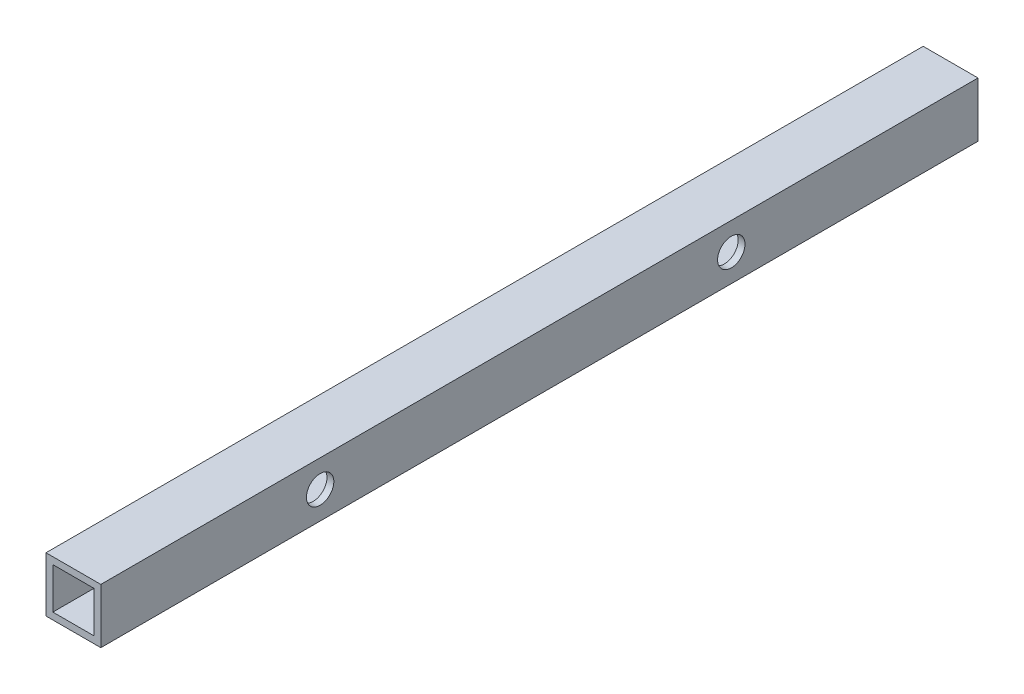
ISO-10303-21;
HEADER;
FILE_DESCRIPTION(('STEP AP214'),'2;1');
FILE_NAME('part.step','',(''),(''),'','','');
FILE_SCHEMA(('AUTOMOTIVE_DESIGN { 1 0 10303 214 1 1 1 1 }'));
ENDSEC;
DATA;
#1=APPLICATION_CONTEXT('core data for automotive mechanical design processes');
#2=APPLICATION_PROTOCOL_DEFINITION('international standard','automotive_design',2000,#1);
#3=PRODUCT_CONTEXT('',#1,'mechanical');
#4=PRODUCT('Part','Part','',(#3));
#5=PRODUCT_RELATED_PRODUCT_CATEGORY('part','',(#4));
#6=PRODUCT_DEFINITION_FORMATION('','',#4);
#7=PRODUCT_DEFINITION_CONTEXT('part definition',#1,'design');
#8=PRODUCT_DEFINITION('design','',#6,#7);
#9=PRODUCT_DEFINITION_SHAPE('','',#8);
#10=(LENGTH_UNIT() NAMED_UNIT(*) SI_UNIT(.MILLI.,.METRE.));
#11=(NAMED_UNIT(*) PLANE_ANGLE_UNIT() SI_UNIT($,.RADIAN.));
#12=(NAMED_UNIT(*) SI_UNIT($,.STERADIAN.) SOLID_ANGLE_UNIT());
#13=UNCERTAINTY_MEASURE_WITH_UNIT(LENGTH_MEASURE(1.E-05),#10,'distance_accuracy_value','');
#14=(GEOMETRIC_REPRESENTATION_CONTEXT(3) GLOBAL_UNCERTAINTY_ASSIGNED_CONTEXT((#13)) GLOBAL_UNIT_ASSIGNED_CONTEXT((#10,
#11,#12)) REPRESENTATION_CONTEXT('',''));
#15=CARTESIAN_POINT('',(0.,0.,0.));
#16=DIRECTION('',(0.,0.,1.));
#17=DIRECTION('',(1.,0.,0.));
#18=AXIS2_PLACEMENT_3D('',#15,#16,#17);
#19=CARTESIAN_POINT('',(0.,0.,406.4));
#20=DIRECTION('',(0.,0.,1.));
#21=DIRECTION('',(1.,0.,0.));
#22=AXIS2_PLACEMENT_3D('',#19,#20,#21);
#23=PLANE('',#22);
#24=DIRECTION('',(0.,1.,0.));
#25=VECTOR('',#24,1.);
#26=CARTESIAN_POINT('',(12.7,-12.7,406.4));
#27=LINE('',#26,#25);
#28=CARTESIAN_POINT('',(12.7,-12.7,406.4));
#29=VERTEX_POINT('',#28);
#30=CARTESIAN_POINT('',(12.7,12.7,406.4));
#31=VERTEX_POINT('',#30);
#32=EDGE_CURVE('E165',#29,#31,#27,.T.);
#33=ORIENTED_EDGE('',*,*,#32,.T.);
#34=DIRECTION('',(-1.,0.,0.));
#35=VECTOR('',#34,1.);
#36=CARTESIAN_POINT('',(-12.7,12.7,406.4));
#37=LINE('',#36,#35);
#38=CARTESIAN_POINT('',(-12.7,12.7,406.4));
#39=VERTEX_POINT('',#38);
#40=EDGE_CURVE('E168',#31,#39,#37,.T.);
#41=ORIENTED_EDGE('',*,*,#40,.T.);
#42=DIRECTION('',(0.,-1.,0.));
#43=VECTOR('',#42,1.);
#44=CARTESIAN_POINT('',(-12.7,-12.7,406.4));
#45=LINE('',#44,#43);
#46=CARTESIAN_POINT('',(-12.7,-12.7,406.4));
#47=VERTEX_POINT('',#46);
#48=EDGE_CURVE('E171',#39,#47,#45,.T.);
#49=ORIENTED_EDGE('',*,*,#48,.T.);
#50=DIRECTION('',(1.,0.,0.));
#51=VECTOR('',#50,1.);
#52=CARTESIAN_POINT('',(-12.7,-12.7,406.4));
#53=LINE('',#52,#51);
#54=EDGE_CURVE('E173',#47,#29,#53,.T.);
#55=ORIENTED_EDGE('',*,*,#54,.T.);
#56=EDGE_LOOP('',(#33,#41,#49,#55));
#57=FACE_BOUND('',#56,.T.);
#58=DIRECTION('',(-1.,0.,0.));
#59=VECTOR('',#58,1.);
#60=CARTESIAN_POINT('',(0.,9.525,406.4));
#61=LINE('',#60,#59);
#62=CARTESIAN_POINT('',(9.525,9.525,406.4));
#63=VERTEX_POINT('',#62);
#64=CARTESIAN_POINT('',(-9.525,9.525,406.4));
#65=VERTEX_POINT('',#64);
#66=EDGE_CURVE('E135',#63,#65,#61,.T.);
#67=ORIENTED_EDGE('',*,*,#66,.F.);
#68=DIRECTION('',(0.,1.,0.));
#69=VECTOR('',#68,1.);
#70=CARTESIAN_POINT('',(9.525,0.,406.4));
#71=LINE('',#70,#69);
#72=CARTESIAN_POINT('',(9.525,-9.525,406.4));
#73=VERTEX_POINT('',#72);
#74=EDGE_CURVE('E127',#73,#63,#71,.T.);
#75=ORIENTED_EDGE('',*,*,#74,.F.);
#76=DIRECTION('',(1.,0.,0.));
#77=VECTOR('',#76,1.);
#78=CARTESIAN_POINT('',(0.,-9.525,406.4));
#79=LINE('',#78,#77);
#80=CARTESIAN_POINT('',(-9.525,-9.525,406.4));
#81=VERTEX_POINT('',#80);
#82=EDGE_CURVE('E149',#81,#73,#79,.T.);
#83=ORIENTED_EDGE('',*,*,#82,.F.);
#84=DIRECTION('',(0.,-1.,0.));
#85=VECTOR('',#84,1.);
#86=CARTESIAN_POINT('',(-9.525,0.,406.4));
#87=LINE('',#86,#85);
#88=EDGE_CURVE('E147',#65,#81,#87,.T.);
#89=ORIENTED_EDGE('',*,*,#88,.F.);
#90=EDGE_LOOP('',(#67,#75,#83,#89));
#91=FACE_BOUND('',#90,.T.);
#92=ADVANCED_FACE('F60',(#57,#91),#23,.T.);
#93=CARTESIAN_POINT('',(0.,0.,0.));
#94=DIRECTION('',(0.,0.,1.));
#95=DIRECTION('',(1.,0.,0.));
#96=AXIS2_PLACEMENT_3D('',#93,#94,#95);
#97=PLANE('',#96);
#98=DIRECTION('',(0.,1.,0.));
#99=VECTOR('',#98,1.);
#100=CARTESIAN_POINT('',(12.7,-12.7,0.));
#101=LINE('',#100,#99);
#102=CARTESIAN_POINT('',(12.7,-12.7,0.));
#103=VERTEX_POINT('',#102);
#104=CARTESIAN_POINT('',(12.7,12.7,0.));
#105=VERTEX_POINT('',#104);
#106=EDGE_CURVE('E143',#103,#105,#101,.T.);
#107=ORIENTED_EDGE('',*,*,#106,.F.);
#108=DIRECTION('',(1.,0.,0.));
#109=VECTOR('',#108,1.);
#110=CARTESIAN_POINT('',(-12.7,-12.7,0.));
#111=LINE('',#110,#109);
#112=CARTESIAN_POINT('',(-12.7,-12.7,0.));
#113=VERTEX_POINT('',#112);
#114=EDGE_CURVE('E169',#113,#103,#111,.T.);
#115=ORIENTED_EDGE('',*,*,#114,.F.);
#116=DIRECTION('',(0.,-1.,0.));
#117=VECTOR('',#116,1.);
#118=CARTESIAN_POINT('',(-12.7,-12.7,0.));
#119=LINE('',#118,#117);
#120=CARTESIAN_POINT('',(-12.7,12.7,0.));
#121=VERTEX_POINT('',#120);
#122=EDGE_CURVE('E180',#121,#113,#119,.T.);
#123=ORIENTED_EDGE('',*,*,#122,.F.);
#124=DIRECTION('',(-1.,0.,0.));
#125=VECTOR('',#124,1.);
#126=CARTESIAN_POINT('',(-12.7,12.7,0.));
#127=LINE('',#126,#125);
#128=EDGE_CURVE('E178',#105,#121,#127,.T.);
#129=ORIENTED_EDGE('',*,*,#128,.F.);
#130=EDGE_LOOP('',(#107,#115,#123,#129));
#131=FACE_BOUND('',#130,.T.);
#132=DIRECTION('',(0.,1.,0.));
#133=VECTOR('',#132,1.);
#134=CARTESIAN_POINT('',(9.525,0.,0.));
#135=LINE('',#134,#133);
#136=CARTESIAN_POINT('',(9.525,-9.525,0.));
#137=VERTEX_POINT('',#136);
#138=CARTESIAN_POINT('',(9.525,9.525,0.));
#139=VERTEX_POINT('',#138);
#140=EDGE_CURVE('E85',#137,#139,#135,.T.);
#141=ORIENTED_EDGE('',*,*,#140,.T.);
#142=DIRECTION('',(-1.,0.,0.));
#143=VECTOR('',#142,1.);
#144=CARTESIAN_POINT('',(0.,9.525,0.));
#145=LINE('',#144,#143);
#146=CARTESIAN_POINT('',(-9.525,9.525,0.));
#147=VERTEX_POINT('',#146);
#148=EDGE_CURVE('E142',#139,#147,#145,.T.);
#149=ORIENTED_EDGE('',*,*,#148,.T.);
#150=DIRECTION('',(0.,-1.,0.));
#151=VECTOR('',#150,1.);
#152=CARTESIAN_POINT('',(-9.525,0.,0.));
#153=LINE('',#152,#151);
#154=CARTESIAN_POINT('',(-9.525,-9.525,0.));
#155=VERTEX_POINT('',#154);
#156=EDGE_CURVE('E157',#147,#155,#153,.T.);
#157=ORIENTED_EDGE('',*,*,#156,.T.);
#158=DIRECTION('',(1.,0.,0.));
#159=VECTOR('',#158,1.);
#160=CARTESIAN_POINT('',(0.,-9.525,0.));
#161=LINE('',#160,#159);
#162=EDGE_CURVE('E136',#155,#137,#161,.T.);
#163=ORIENTED_EDGE('',*,*,#162,.T.);
#164=EDGE_LOOP('',(#141,#149,#157,#163));
#165=FACE_BOUND('',#164,.T.);
#166=ADVANCED_FACE('F227',(#131,#165),#97,.F.);
#167=CARTESIAN_POINT('',(12.7,-12.7,406.4));
#168=DIRECTION('',(-1.,0.,0.));
#169=DIRECTION('',(0.,0.,1.));
#170=AXIS2_PLACEMENT_3D('',#167,#168,#169);
#171=PLANE('',#170);
#172=CARTESIAN_POINT('',(12.7,0.,304.8));
#173=DIRECTION('',(1.,0.,0.));
#174=DIRECTION('',(0.,0.,-1.));
#175=AXIS2_PLACEMENT_3D('',#172,#173,#174);
#176=CIRCLE('',#175,6.35);
#177=CARTESIAN_POINT('',(12.7,0.,298.45));
#178=VERTEX_POINT('',#177);
#179=EDGE_CURVE('E198',#178,#178,#176,.T.);
#180=ORIENTED_EDGE('',*,*,#179,.F.);
#181=EDGE_LOOP('',(#180));
#182=FACE_BOUND('',#181,.T.);
#183=CARTESIAN_POINT('',(12.7,0.,114.3));
#184=DIRECTION('',(1.,0.,0.));
#185=DIRECTION('',(0.,0.,-1.));
#186=AXIS2_PLACEMENT_3D('',#183,#184,#185);
#187=CIRCLE('',#186,6.35);
#188=CARTESIAN_POINT('',(12.7,0.,107.95));
#189=VERTEX_POINT('',#188);
#190=EDGE_CURVE('E208',#189,#189,#187,.T.);
#191=ORIENTED_EDGE('',*,*,#190,.F.);
#192=EDGE_LOOP('',(#191));
#193=FACE_BOUND('',#192,.T.);
#194=ORIENTED_EDGE('',*,*,#106,.T.);
#195=DIRECTION('',(0.,0.,-1.));
#196=VECTOR('',#195,1.);
#197=CARTESIAN_POINT('',(12.7,12.7,406.4));
#198=LINE('',#197,#196);
#199=EDGE_CURVE('E12',#31,#105,#198,.T.);
#200=ORIENTED_EDGE('',*,*,#199,.F.);
#201=ORIENTED_EDGE('',*,*,#32,.F.);
#202=DIRECTION('',(0.,0.,-1.));
#203=VECTOR('',#202,1.);
#204=CARTESIAN_POINT('',(12.7,-12.7,406.4));
#205=LINE('',#204,#203);
#206=EDGE_CURVE('E175',#29,#103,#205,.T.);
#207=ORIENTED_EDGE('',*,*,#206,.T.);
#208=EDGE_LOOP('',(#194,#200,#201,#207));
#209=FACE_BOUND('',#208,.T.);
#210=ADVANCED_FACE('F62',(#182,#193,#209),#171,.F.);
#211=CARTESIAN_POINT('',(-12.7,12.7,406.4));
#212=DIRECTION('',(0.,-1.,0.));
#213=DIRECTION('',(0.,0.,-1.));
#214=AXIS2_PLACEMENT_3D('',#211,#212,#213);
#215=PLANE('',#214);
#216=ORIENTED_EDGE('',*,*,#128,.T.);
#217=DIRECTION('',(0.,0.,-1.));
#218=VECTOR('',#217,1.);
#219=CARTESIAN_POINT('',(-12.7,12.7,406.4));
#220=LINE('',#219,#218);
#221=EDGE_CURVE('E69',#39,#121,#220,.T.);
#222=ORIENTED_EDGE('',*,*,#221,.F.);
#223=ORIENTED_EDGE('',*,*,#40,.F.);
#224=ORIENTED_EDGE('',*,*,#199,.T.);
#225=EDGE_LOOP('',(#216,#222,#223,#224));
#226=FACE_BOUND('',#225,.T.);
#227=ADVANCED_FACE('F253',(#226),#215,.F.);
#228=CARTESIAN_POINT('',(-12.7,-12.7,406.4));
#229=DIRECTION('',(1.,0.,0.));
#230=DIRECTION('',(0.,0.,-1.));
#231=AXIS2_PLACEMENT_3D('',#228,#229,#230);
#232=PLANE('',#231);
#233=CARTESIAN_POINT('',(-12.7,0.,304.8));
#234=DIRECTION('',(1.,0.,0.));
#235=DIRECTION('',(0.,0.,-1.));
#236=AXIS2_PLACEMENT_3D('',#233,#234,#235);
#237=CIRCLE('',#236,6.35);
#238=CARTESIAN_POINT('',(-12.7,0.,298.45));
#239=VERTEX_POINT('',#238);
#240=EDGE_CURVE('E192',#239,#239,#237,.T.);
#241=ORIENTED_EDGE('',*,*,#240,.T.);
#242=EDGE_LOOP('',(#241));
#243=FACE_BOUND('',#242,.T.);
#244=CARTESIAN_POINT('',(-12.7,0.,114.3));
#245=DIRECTION('',(1.,0.,0.));
#246=DIRECTION('',(0.,0.,-1.));
#247=AXIS2_PLACEMENT_3D('',#244,#245,#246);
#248=CIRCLE('',#247,6.35);
#249=CARTESIAN_POINT('',(-12.7,0.,107.95));
#250=VERTEX_POINT('',#249);
#251=EDGE_CURVE('E203',#250,#250,#248,.T.);
#252=ORIENTED_EDGE('',*,*,#251,.T.);
#253=EDGE_LOOP('',(#252));
#254=FACE_BOUND('',#253,.T.);
#255=ORIENTED_EDGE('',*,*,#122,.T.);
#256=DIRECTION('',(0.,0.,-1.));
#257=VECTOR('',#256,1.);
#258=CARTESIAN_POINT('',(-12.7,-12.7,406.4));
#259=LINE('',#258,#257);
#260=EDGE_CURVE('E185',#47,#113,#259,.T.);
#261=ORIENTED_EDGE('',*,*,#260,.F.);
#262=ORIENTED_EDGE('',*,*,#48,.F.);
#263=ORIENTED_EDGE('',*,*,#221,.T.);
#264=EDGE_LOOP('',(#255,#261,#262,#263));
#265=FACE_BOUND('',#264,.T.);
#266=ADVANCED_FACE('F250',(#243,#254,#265),#232,.F.);
#267=CARTESIAN_POINT('',(-12.7,-12.7,406.4));
#268=DIRECTION('',(0.,1.,0.));
#269=DIRECTION('',(0.,0.,1.));
#270=AXIS2_PLACEMENT_3D('',#267,#268,#269);
#271=PLANE('',#270);
#272=ORIENTED_EDGE('',*,*,#114,.T.);
#273=ORIENTED_EDGE('',*,*,#206,.F.);
#274=ORIENTED_EDGE('',*,*,#54,.F.);
#275=ORIENTED_EDGE('',*,*,#260,.T.);
#276=EDGE_LOOP('',(#272,#273,#274,#275));
#277=FACE_BOUND('',#276,.T.);
#278=ADVANCED_FACE('F247',(#277),#271,.F.);
#279=CARTESIAN_POINT('',(9.525,0.,406.4));
#280=DIRECTION('',(-1.,0.,0.));
#281=DIRECTION('',(0.,0.,1.));
#282=AXIS2_PLACEMENT_3D('',#279,#280,#281);
#283=PLANE('',#282);
#284=CARTESIAN_POINT('',(9.525,0.,304.8));
#285=DIRECTION('',(-1.,0.,0.));
#286=DIRECTION('',(0.,0.,1.));
#287=AXIS2_PLACEMENT_3D('',#284,#285,#286);
#288=CIRCLE('',#287,6.35);
#289=CARTESIAN_POINT('',(9.525,0.,311.15));
#290=VERTEX_POINT('',#289);
#291=EDGE_CURVE('E155',#290,#290,#288,.T.);
#292=ORIENTED_EDGE('',*,*,#291,.F.);
#293=EDGE_LOOP('',(#292));
#294=FACE_BOUND('',#293,.T.);
#295=CARTESIAN_POINT('',(9.525,0.,114.3));
#296=DIRECTION('',(-1.,0.,0.));
#297=DIRECTION('',(0.,0.,1.));
#298=AXIS2_PLACEMENT_3D('',#295,#296,#297);
#299=CIRCLE('',#298,6.35);
#300=CARTESIAN_POINT('',(9.525,0.,120.65));
#301=VERTEX_POINT('',#300);
#302=EDGE_CURVE('E191',#301,#301,#299,.T.);
#303=ORIENTED_EDGE('',*,*,#302,.F.);
#304=EDGE_LOOP('',(#303));
#305=FACE_BOUND('',#304,.T.);
#306=ORIENTED_EDGE('',*,*,#140,.F.);
#307=DIRECTION('',(0.,0.,-1.));
#308=VECTOR('',#307,1.);
#309=CARTESIAN_POINT('',(9.525,-9.525,406.4));
#310=LINE('',#309,#308);
#311=EDGE_CURVE('E131',#73,#137,#310,.T.);
#312=ORIENTED_EDGE('',*,*,#311,.F.);
#313=ORIENTED_EDGE('',*,*,#74,.T.);
#314=DIRECTION('',(0.,0.,-1.));
#315=VECTOR('',#314,1.);
#316=CARTESIAN_POINT('',(9.525,9.525,406.4));
#317=LINE('',#316,#315);
#318=EDGE_CURVE('E130',#63,#139,#317,.T.);
#319=ORIENTED_EDGE('',*,*,#318,.T.);
#320=EDGE_LOOP('',(#306,#312,#313,#319));
#321=FACE_BOUND('',#320,.T.);
#322=ADVANCED_FACE('F129',(#294,#305,#321),#283,.T.);
#323=CARTESIAN_POINT('',(0.,9.525,406.4));
#324=DIRECTION('',(0.,-1.,0.));
#325=DIRECTION('',(0.,0.,-1.));
#326=AXIS2_PLACEMENT_3D('',#323,#324,#325);
#327=PLANE('',#326);
#328=ORIENTED_EDGE('',*,*,#148,.F.);
#329=ORIENTED_EDGE('',*,*,#318,.F.);
#330=ORIENTED_EDGE('',*,*,#66,.T.);
#331=DIRECTION('',(0.,0.,-1.));
#332=VECTOR('',#331,1.);
#333=CARTESIAN_POINT('',(-9.525,9.525,406.4));
#334=LINE('',#333,#332);
#335=EDGE_CURVE('E144',#65,#147,#334,.T.);
#336=ORIENTED_EDGE('',*,*,#335,.T.);
#337=EDGE_LOOP('',(#328,#329,#330,#336));
#338=FACE_BOUND('',#337,.T.);
#339=ADVANCED_FACE('F139',(#338),#327,.T.);
#340=CARTESIAN_POINT('',(-9.525,0.,406.4));
#341=DIRECTION('',(1.,0.,0.));
#342=DIRECTION('',(0.,0.,-1.));
#343=AXIS2_PLACEMENT_3D('',#340,#341,#342);
#344=PLANE('',#343);
#345=CARTESIAN_POINT('',(-9.525,0.,304.8));
#346=DIRECTION('',(1.,0.,0.));
#347=DIRECTION('',(0.,0.,-1.));
#348=AXIS2_PLACEMENT_3D('',#345,#346,#347);
#349=CIRCLE('',#348,6.35);
#350=CARTESIAN_POINT('',(-9.525,0.,298.45));
#351=VERTEX_POINT('',#350);
#352=EDGE_CURVE('E64',#351,#351,#349,.T.);
#353=ORIENTED_EDGE('',*,*,#352,.F.);
#354=EDGE_LOOP('',(#353));
#355=FACE_BOUND('',#354,.T.);
#356=CARTESIAN_POINT('',(-9.525,0.,114.3));
#357=DIRECTION('',(1.,0.,0.));
#358=DIRECTION('',(0.,0.,-1.));
#359=AXIS2_PLACEMENT_3D('',#356,#357,#358);
#360=CIRCLE('',#359,6.35);
#361=CARTESIAN_POINT('',(-9.525,0.,107.95));
#362=VERTEX_POINT('',#361);
#363=EDGE_CURVE('E189',#362,#362,#360,.T.);
#364=ORIENTED_EDGE('',*,*,#363,.F.);
#365=EDGE_LOOP('',(#364));
#366=FACE_BOUND('',#365,.T.);
#367=ORIENTED_EDGE('',*,*,#156,.F.);
#368=ORIENTED_EDGE('',*,*,#335,.F.);
#369=ORIENTED_EDGE('',*,*,#88,.T.);
#370=DIRECTION('',(0.,0.,-1.));
#371=VECTOR('',#370,1.);
#372=CARTESIAN_POINT('',(-9.525,-9.525,406.4));
#373=LINE('',#372,#371);
#374=EDGE_CURVE('E77',#81,#155,#373,.T.);
#375=ORIENTED_EDGE('',*,*,#374,.T.);
#376=EDGE_LOOP('',(#367,#368,#369,#375));
#377=FACE_BOUND('',#376,.T.);
#378=ADVANCED_FACE('F219',(#355,#366,#377),#344,.T.);
#379=CARTESIAN_POINT('',(0.,-9.525,406.4));
#380=DIRECTION('',(0.,1.,0.));
#381=DIRECTION('',(0.,0.,1.));
#382=AXIS2_PLACEMENT_3D('',#379,#380,#381);
#383=PLANE('',#382);
#384=ORIENTED_EDGE('',*,*,#162,.F.);
#385=ORIENTED_EDGE('',*,*,#374,.F.);
#386=ORIENTED_EDGE('',*,*,#82,.T.);
#387=ORIENTED_EDGE('',*,*,#311,.T.);
#388=EDGE_LOOP('',(#384,#385,#386,#387));
#389=FACE_BOUND('',#388,.T.);
#390=ADVANCED_FACE('F222',(#389),#383,.T.);
#391=CARTESIAN_POINT('',(-12.7,0.,114.3));
#392=DIRECTION('',(1.,0.,0.));
#393=DIRECTION('',(0.,0.,-1.));
#394=AXIS2_PLACEMENT_3D('',#391,#392,#393);
#395=CYLINDRICAL_SURFACE('',#394,6.35);
#396=ORIENTED_EDGE('',*,*,#363,.T.);
#397=EDGE_LOOP('',(#396));
#398=FACE_BOUND('',#397,.T.);
#399=ORIENTED_EDGE('',*,*,#251,.F.);
#400=EDGE_LOOP('',(#399));
#401=FACE_BOUND('',#400,.T.);
#402=ADVANCED_FACE('F229',(#398,#401),#395,.F.);
#403=CARTESIAN_POINT('',(-12.7,0.,304.8));
#404=DIRECTION('',(1.,0.,0.));
#405=DIRECTION('',(0.,0.,-1.));
#406=AXIS2_PLACEMENT_3D('',#403,#404,#405);
#407=CYLINDRICAL_SURFACE('',#406,6.35);
#408=ORIENTED_EDGE('',*,*,#352,.T.);
#409=EDGE_LOOP('',(#408));
#410=FACE_BOUND('',#409,.T.);
#411=ORIENTED_EDGE('',*,*,#240,.F.);
#412=EDGE_LOOP('',(#411));
#413=FACE_BOUND('',#412,.T.);
#414=ADVANCED_FACE('F216',(#410,#413),#407,.F.);
#415=ORIENTED_EDGE('',*,*,#302,.T.);
#416=EDGE_LOOP('',(#415));
#417=FACE_BOUND('',#416,.T.);
#418=ORIENTED_EDGE('',*,*,#190,.T.);
#419=EDGE_LOOP('',(#418));
#420=FACE_BOUND('',#419,.T.);
#421=ADVANCED_FACE('F235',(#417,#420),#395,.F.);
#422=ORIENTED_EDGE('',*,*,#291,.T.);
#423=EDGE_LOOP('',(#422));
#424=FACE_BOUND('',#423,.T.);
#425=ORIENTED_EDGE('',*,*,#179,.T.);
#426=EDGE_LOOP('',(#425));
#427=FACE_BOUND('',#426,.T.);
#428=ADVANCED_FACE('F279',(#424,#427),#407,.F.);
#429=CLOSED_SHELL('',(#92,#166,#210,#227,#266,#278,#322,#339,#378,#390,#402,#414,#421,#428));
#430=MANIFOLD_SOLID_BREP('B2',#429);
#431=ADVANCED_BREP_SHAPE_REPRESENTATION('',(#18,#430),#14);
#432=SHAPE_DEFINITION_REPRESENTATION(#9,#431);
ENDSEC;
END-ISO-10303-21;
